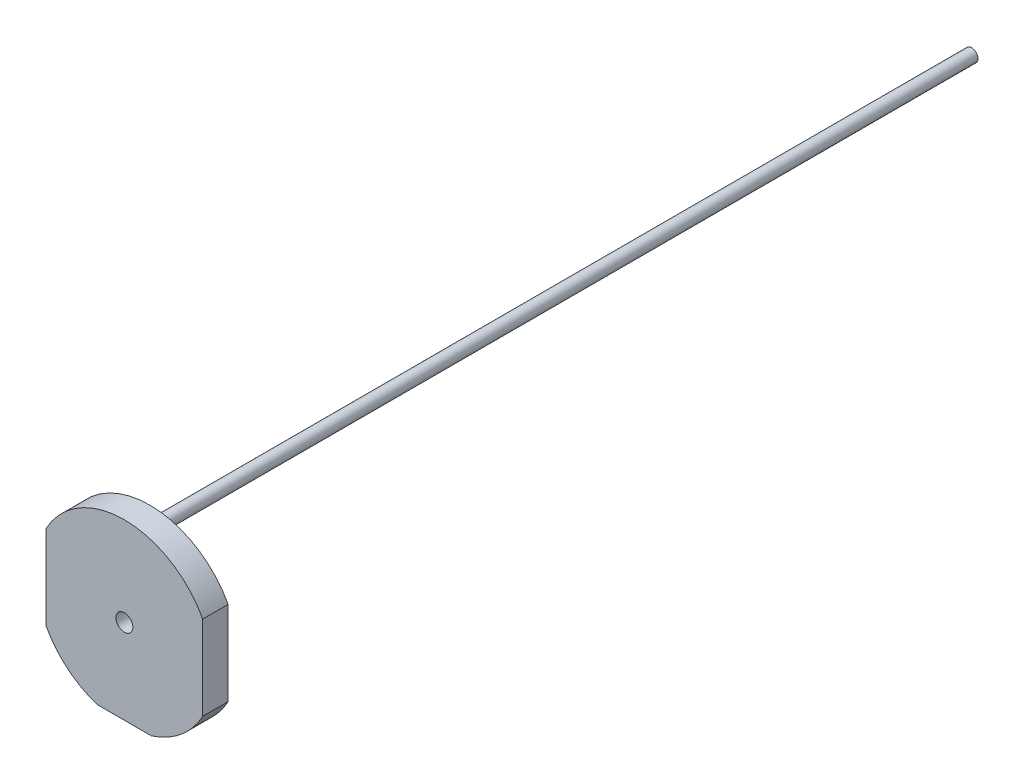
ISO-10303-21;
HEADER;
FILE_DESCRIPTION(('STEP AP214'),'2;1');
FILE_NAME('part.step','',(''),(''),'','','');
FILE_SCHEMA(('AUTOMOTIVE_DESIGN { 1 0 10303 214 1 1 1 1 }'));
ENDSEC;
DATA;
#1=APPLICATION_CONTEXT('core data for automotive mechanical design processes');
#2=APPLICATION_PROTOCOL_DEFINITION('international standard','automotive_design',2000,#1);
#3=PRODUCT_CONTEXT('',#1,'mechanical');
#4=PRODUCT('Part','Part','',(#3));
#5=PRODUCT_RELATED_PRODUCT_CATEGORY('part','',(#4));
#6=PRODUCT_DEFINITION_FORMATION('','',#4);
#7=PRODUCT_DEFINITION_CONTEXT('part definition',#1,'design');
#8=PRODUCT_DEFINITION('design','',#6,#7);
#9=PRODUCT_DEFINITION_SHAPE('','',#8);
#10=(LENGTH_UNIT() NAMED_UNIT(*) SI_UNIT(.MILLI.,.METRE.));
#11=(NAMED_UNIT(*) PLANE_ANGLE_UNIT() SI_UNIT($,.RADIAN.));
#12=(NAMED_UNIT(*) SI_UNIT($,.STERADIAN.) SOLID_ANGLE_UNIT());
#13=UNCERTAINTY_MEASURE_WITH_UNIT(LENGTH_MEASURE(1.E-05),#10,'distance_accuracy_value','');
#14=(GEOMETRIC_REPRESENTATION_CONTEXT(3) GLOBAL_UNCERTAINTY_ASSIGNED_CONTEXT((#13)) GLOBAL_UNIT_ASSIGNED_CONTEXT((#10,
#11,#12)) REPRESENTATION_CONTEXT('',''));
#15=CARTESIAN_POINT('',(0.,0.,0.));
#16=DIRECTION('',(0.,0.,1.));
#17=DIRECTION('',(1.,0.,0.));
#18=AXIS2_PLACEMENT_3D('',#15,#16,#17);
#19=CARTESIAN_POINT('',(0.,0.,-6.));
#20=DIRECTION('',(0.,0.,1.));
#21=DIRECTION('',(1.,0.,0.));
#22=AXIS2_PLACEMENT_3D('',#19,#20,#21);
#23=CYLINDRICAL_SURFACE('',#22,21.);
#24=CARTESIAN_POINT('',(0.,0.,0.));
#25=DIRECTION('',(0.,0.,1.));
#26=DIRECTION('',(1.,0.,0.));
#27=AXIS2_PLACEMENT_3D('',#24,#25,#26);
#28=CIRCLE('',#27,21.);
#29=CARTESIAN_POINT('',(-18.5,-9.9373034571759,0.));
#30=VERTEX_POINT('',#29);
#31=CARTESIAN_POINT('',(-6.40312423743285,-20.,0.));
#32=VERTEX_POINT('',#31);
#33=EDGE_CURVE('E136',#30,#32,#28,.T.);
#34=ORIENTED_EDGE('',*,*,#33,.F.);
#35=DIRECTION('',(0.,0.,1.));
#36=VECTOR('',#35,1.);
#37=CARTESIAN_POINT('',(-18.5,-9.9373034571759,-6.));
#38=LINE('',#37,#36);
#39=CARTESIAN_POINT('',(-18.5,-9.9373034571759,-6.));
#40=VERTEX_POINT('',#39);
#41=EDGE_CURVE('E11',#40,#30,#38,.T.);
#42=ORIENTED_EDGE('',*,*,#41,.F.);
#43=CARTESIAN_POINT('',(0.,0.,-6.));
#44=DIRECTION('',(0.,0.,1.));
#45=DIRECTION('',(1.,0.,0.));
#46=AXIS2_PLACEMENT_3D('',#43,#44,#45);
#47=CIRCLE('',#46,21.);
#48=CARTESIAN_POINT('',(-6.40312423743285,-20.,-6.));
#49=VERTEX_POINT('',#48);
#50=EDGE_CURVE('E157',#40,#49,#47,.T.);
#51=ORIENTED_EDGE('',*,*,#50,.T.);
#52=DIRECTION('',(0.,0.,1.));
#53=VECTOR('',#52,1.);
#54=CARTESIAN_POINT('',(-6.40312423743285,-20.,-6.));
#55=LINE('',#54,#53);
#56=EDGE_CURVE('E48',#49,#32,#55,.T.);
#57=ORIENTED_EDGE('',*,*,#56,.T.);
#58=EDGE_LOOP('',(#34,#42,#51,#57));
#59=FACE_BOUND('',#58,.T.);
#60=ADVANCED_FACE('F45',(#59),#23,.T.);
#61=CARTESIAN_POINT('',(-18.5,-9.9373034571759,-6.));
#62=DIRECTION('',(-1.,0.,0.));
#63=DIRECTION('',(0.,0.,1.));
#64=AXIS2_PLACEMENT_3D('',#61,#62,#63);
#65=PLANE('',#64);
#66=DIRECTION('',(0.,-1.,0.));
#67=VECTOR('',#66,1.);
#68=CARTESIAN_POINT('',(-18.5,-9.9373034571759,0.));
#69=LINE('',#68,#67);
#70=CARTESIAN_POINT('',(-18.5,9.9373034571759,0.));
#71=VERTEX_POINT('',#70);
#72=EDGE_CURVE('E154',#71,#30,#69,.T.);
#73=ORIENTED_EDGE('',*,*,#72,.F.);
#74=DIRECTION('',(0.,0.,1.));
#75=VECTOR('',#74,1.);
#76=CARTESIAN_POINT('',(-18.5,9.9373034571759,-6.));
#77=LINE('',#76,#75);
#78=CARTESIAN_POINT('',(-18.5,9.9373034571759,-6.));
#79=VERTEX_POINT('',#78);
#80=EDGE_CURVE('E55',#79,#71,#77,.T.);
#81=ORIENTED_EDGE('',*,*,#80,.F.);
#82=DIRECTION('',(0.,-1.,0.));
#83=VECTOR('',#82,1.);
#84=CARTESIAN_POINT('',(-18.5,-9.9373034571759,-6.));
#85=LINE('',#84,#83);
#86=EDGE_CURVE('E122',#79,#40,#85,.T.);
#87=ORIENTED_EDGE('',*,*,#86,.T.);
#88=ORIENTED_EDGE('',*,*,#41,.T.);
#89=EDGE_LOOP('',(#73,#81,#87,#88));
#90=FACE_BOUND('',#89,.T.);
#91=ADVANCED_FACE('F169',(#90),#65,.T.);
#92=CARTESIAN_POINT('',(0.,0.,-6.));
#93=DIRECTION('',(0.,0.,1.));
#94=DIRECTION('',(1.,0.,0.));
#95=AXIS2_PLACEMENT_3D('',#92,#93,#94);
#96=CYLINDRICAL_SURFACE('',#95,21.);
#97=CARTESIAN_POINT('',(0.,0.,0.));
#98=DIRECTION('',(0.,0.,1.));
#99=DIRECTION('',(1.,0.,0.));
#100=AXIS2_PLACEMENT_3D('',#97,#98,#99);
#101=CIRCLE('',#100,21.);
#102=CARTESIAN_POINT('',(18.5,9.9373034571759,0.));
#103=VERTEX_POINT('',#102);
#104=EDGE_CURVE('E108',#103,#71,#101,.T.);
#105=ORIENTED_EDGE('',*,*,#104,.F.);
#106=DIRECTION('',(0.,0.,1.));
#107=VECTOR('',#106,1.);
#108=CARTESIAN_POINT('',(18.5,9.9373034571759,-6.));
#109=LINE('',#108,#107);
#110=CARTESIAN_POINT('',(18.5,9.9373034571759,-6.));
#111=VERTEX_POINT('',#110);
#112=EDGE_CURVE('E103',#111,#103,#109,.T.);
#113=ORIENTED_EDGE('',*,*,#112,.F.);
#114=CARTESIAN_POINT('',(0.,0.,-6.));
#115=DIRECTION('',(0.,0.,1.));
#116=DIRECTION('',(1.,0.,0.));
#117=AXIS2_PLACEMENT_3D('',#114,#115,#116);
#118=CIRCLE('',#117,21.);
#119=EDGE_CURVE('E106',#111,#79,#118,.T.);
#120=ORIENTED_EDGE('',*,*,#119,.T.);
#121=ORIENTED_EDGE('',*,*,#80,.T.);
#122=EDGE_LOOP('',(#105,#113,#120,#121));
#123=FACE_BOUND('',#122,.T.);
#124=ADVANCED_FACE('F105',(#123),#96,.T.);
#125=CARTESIAN_POINT('',(18.5,-9.9373034571759,-6.));
#126=DIRECTION('',(1.,0.,0.));
#127=DIRECTION('',(0.,0.,-1.));
#128=AXIS2_PLACEMENT_3D('',#125,#126,#127);
#129=PLANE('',#128);
#130=DIRECTION('',(0.,1.,0.));
#131=VECTOR('',#130,1.);
#132=CARTESIAN_POINT('',(18.5,-9.9373034571759,0.));
#133=LINE('',#132,#131);
#134=CARTESIAN_POINT('',(18.5,-9.9373034571759,0.));
#135=VERTEX_POINT('',#134);
#136=EDGE_CURVE('E149',#135,#103,#133,.T.);
#137=ORIENTED_EDGE('',*,*,#136,.F.);
#138=DIRECTION('',(0.,0.,1.));
#139=VECTOR('',#138,1.);
#140=CARTESIAN_POINT('',(18.5,-9.9373034571759,-6.));
#141=LINE('',#140,#139);
#142=CARTESIAN_POINT('',(18.5,-9.9373034571759,-6.));
#143=VERTEX_POINT('',#142);
#144=EDGE_CURVE('E114',#143,#135,#141,.T.);
#145=ORIENTED_EDGE('',*,*,#144,.F.);
#146=DIRECTION('',(0.,1.,0.));
#147=VECTOR('',#146,1.);
#148=CARTESIAN_POINT('',(18.5,-9.9373034571759,-6.));
#149=LINE('',#148,#147);
#150=EDGE_CURVE('E120',#143,#111,#149,.T.);
#151=ORIENTED_EDGE('',*,*,#150,.T.);
#152=ORIENTED_EDGE('',*,*,#112,.T.);
#153=EDGE_LOOP('',(#137,#145,#151,#152));
#154=FACE_BOUND('',#153,.T.);
#155=ADVANCED_FACE('F125',(#154),#129,.T.);
#156=CARTESIAN_POINT('',(0.,0.,-6.));
#157=DIRECTION('',(0.,0.,1.));
#158=DIRECTION('',(1.,0.,0.));
#159=AXIS2_PLACEMENT_3D('',#156,#157,#158);
#160=CYLINDRICAL_SURFACE('',#159,21.);
#161=CARTESIAN_POINT('',(0.,0.,0.));
#162=DIRECTION('',(0.,0.,1.));
#163=DIRECTION('',(1.,0.,0.));
#164=AXIS2_PLACEMENT_3D('',#161,#162,#163);
#165=CIRCLE('',#164,21.);
#166=CARTESIAN_POINT('',(6.40312423743285,-20.,0.));
#167=VERTEX_POINT('',#166);
#168=EDGE_CURVE('E145',#167,#135,#165,.T.);
#169=ORIENTED_EDGE('',*,*,#168,.F.);
#170=DIRECTION('',(0.,0.,1.));
#171=VECTOR('',#170,1.);
#172=CARTESIAN_POINT('',(6.40312423743285,-20.,-6.));
#173=LINE('',#172,#171);
#174=CARTESIAN_POINT('',(6.40312423743285,-20.,-6.));
#175=VERTEX_POINT('',#174);
#176=EDGE_CURVE('E162',#175,#167,#173,.T.);
#177=ORIENTED_EDGE('',*,*,#176,.F.);
#178=CARTESIAN_POINT('',(0.,0.,-6.));
#179=DIRECTION('',(0.,0.,1.));
#180=DIRECTION('',(1.,0.,0.));
#181=AXIS2_PLACEMENT_3D('',#178,#179,#180);
#182=CIRCLE('',#181,21.);
#183=EDGE_CURVE('E127',#175,#143,#182,.T.);
#184=ORIENTED_EDGE('',*,*,#183,.T.);
#185=ORIENTED_EDGE('',*,*,#144,.T.);
#186=EDGE_LOOP('',(#169,#177,#184,#185));
#187=FACE_BOUND('',#186,.T.);
#188=ADVANCED_FACE('F182',(#187),#160,.T.);
#189=CARTESIAN_POINT('',(-6.40312423743285,-20.,-6.));
#190=DIRECTION('',(0.,-1.,0.));
#191=DIRECTION('',(0.,0.,-1.));
#192=AXIS2_PLACEMENT_3D('',#189,#190,#191);
#193=PLANE('',#192);
#194=DIRECTION('',(1.,0.,0.));
#195=VECTOR('',#194,1.);
#196=CARTESIAN_POINT('',(-6.40312423743285,-20.,0.));
#197=LINE('',#196,#195);
#198=EDGE_CURVE('E140',#32,#167,#197,.T.);
#199=ORIENTED_EDGE('',*,*,#198,.F.);
#200=ORIENTED_EDGE('',*,*,#56,.F.);
#201=DIRECTION('',(1.,0.,0.));
#202=VECTOR('',#201,1.);
#203=CARTESIAN_POINT('',(-6.40312423743285,-20.,-6.));
#204=LINE('',#203,#202);
#205=EDGE_CURVE('E130',#49,#175,#204,.T.);
#206=ORIENTED_EDGE('',*,*,#205,.T.);
#207=ORIENTED_EDGE('',*,*,#176,.T.);
#208=EDGE_LOOP('',(#199,#200,#206,#207));
#209=FACE_BOUND('',#208,.T.);
#210=ADVANCED_FACE('F166',(#209),#193,.T.);
#211=CARTESIAN_POINT('',(0.,0.,-6.));
#212=DIRECTION('',(0.,0.,1.));
#213=DIRECTION('',(1.,0.,0.));
#214=AXIS2_PLACEMENT_3D('',#211,#212,#213);
#215=PLANE('',#214);
#216=CARTESIAN_POINT('',(0.,16.,-6.00000000000001));
#217=DIRECTION('',(0.,0.,1.));
#218=DIRECTION('',(1.,0.,0.));
#219=AXIS2_PLACEMENT_3D('',#216,#217,#218);
#220=CIRCLE('',#219,1.5);
#221=CARTESIAN_POINT('',(1.5,16.,-6.00000000000001));
#222=VERTEX_POINT('',#221);
#223=EDGE_CURVE('E214',#222,#222,#220,.T.);
#224=ORIENTED_EDGE('',*,*,#223,.T.);
#225=EDGE_LOOP('',(#224));
#226=FACE_BOUND('',#225,.T.);
#227=CARTESIAN_POINT('',(0.,0.,-6.));
#228=DIRECTION('',(0.,0.,1.));
#229=DIRECTION('',(1.,0.,0.));
#230=AXIS2_PLACEMENT_3D('',#227,#228,#229);
#231=CIRCLE('',#230,2.);
#232=CARTESIAN_POINT('',(2.,0.,-6.));
#233=VERTEX_POINT('',#232);
#234=EDGE_CURVE('E141',#233,#233,#231,.T.);
#235=ORIENTED_EDGE('',*,*,#234,.T.);
#236=EDGE_LOOP('',(#235));
#237=FACE_BOUND('',#236,.T.);
#238=ORIENTED_EDGE('',*,*,#50,.F.);
#239=ORIENTED_EDGE('',*,*,#86,.F.);
#240=ORIENTED_EDGE('',*,*,#119,.F.);
#241=ORIENTED_EDGE('',*,*,#150,.F.);
#242=ORIENTED_EDGE('',*,*,#183,.F.);
#243=ORIENTED_EDGE('',*,*,#205,.F.);
#244=EDGE_LOOP('',(#238,#239,#240,#241,#242,#243));
#245=FACE_BOUND('',#244,.T.);
#246=ADVANCED_FACE('F118',(#226,#237,#245),#215,.F.);
#247=CARTESIAN_POINT('',(0.,0.,0.));
#248=DIRECTION('',(0.,0.,1.));
#249=DIRECTION('',(1.,0.,0.));
#250=AXIS2_PLACEMENT_3D('',#247,#248,#249);
#251=PLANE('',#250);
#252=CARTESIAN_POINT('',(0.,0.,0.));
#253=DIRECTION('',(0.,0.,1.));
#254=DIRECTION('',(1.,0.,0.));
#255=AXIS2_PLACEMENT_3D('',#252,#253,#254);
#256=CIRCLE('',#255,2.);
#257=CARTESIAN_POINT('',(2.,0.,0.));
#258=VERTEX_POINT('',#257);
#259=EDGE_CURVE('E217',#258,#258,#256,.T.);
#260=ORIENTED_EDGE('',*,*,#259,.F.);
#261=EDGE_LOOP('',(#260));
#262=FACE_BOUND('',#261,.T.);
#263=ORIENTED_EDGE('',*,*,#33,.T.);
#264=ORIENTED_EDGE('',*,*,#198,.T.);
#265=ORIENTED_EDGE('',*,*,#168,.T.);
#266=ORIENTED_EDGE('',*,*,#136,.T.);
#267=ORIENTED_EDGE('',*,*,#104,.T.);
#268=ORIENTED_EDGE('',*,*,#72,.T.);
#269=EDGE_LOOP('',(#263,#264,#265,#266,#267,#268));
#270=FACE_BOUND('',#269,.T.);
#271=ADVANCED_FACE('F168',(#262,#270),#251,.T.);
#272=CARTESIAN_POINT('',(0.,0.,-6.));
#273=DIRECTION('',(0.,0.,1.));
#274=DIRECTION('',(1.,0.,0.));
#275=AXIS2_PLACEMENT_3D('',#272,#273,#274);
#276=CYLINDRICAL_SURFACE('',#275,2.);
#277=ORIENTED_EDGE('',*,*,#234,.F.);
#278=EDGE_LOOP('',(#277));
#279=FACE_BOUND('',#278,.T.);
#280=ORIENTED_EDGE('',*,*,#259,.T.);
#281=EDGE_LOOP('',(#280));
#282=FACE_BOUND('',#281,.T.);
#283=ADVANCED_FACE('F194',(#279,#282),#276,.F.);
#284=CARTESIAN_POINT('',(0.,16.,-200.));
#285=DIRECTION('',(0.,0.,1.));
#286=DIRECTION('',(1.,0.,0.));
#287=AXIS2_PLACEMENT_3D('',#284,#285,#286);
#288=CYLINDRICAL_SURFACE('',#287,1.5);
#289=CARTESIAN_POINT('',(0.,16.,-200.));
#290=DIRECTION('',(0.,0.,1.));
#291=DIRECTION('',(1.,0.,0.));
#292=AXIS2_PLACEMENT_3D('',#289,#290,#291);
#293=CIRCLE('',#292,1.5);
#294=CARTESIAN_POINT('',(1.5,16.,-200.));
#295=VERTEX_POINT('',#294);
#296=EDGE_CURVE('E212',#295,#295,#293,.T.);
#297=ORIENTED_EDGE('',*,*,#296,.T.);
#298=EDGE_LOOP('',(#297));
#299=FACE_BOUND('',#298,.T.);
#300=ORIENTED_EDGE('',*,*,#223,.F.);
#301=EDGE_LOOP('',(#300));
#302=FACE_BOUND('',#301,.T.);
#303=ADVANCED_FACE('F200',(#299,#302),#288,.T.);
#304=CARTESIAN_POINT('',(0.,0.,-200.));
#305=DIRECTION('',(0.,0.,1.));
#306=DIRECTION('',(1.,0.,0.));
#307=AXIS2_PLACEMENT_3D('',#304,#305,#306);
#308=PLANE('',#307);
#309=ORIENTED_EDGE('',*,*,#296,.F.);
#310=EDGE_LOOP('',(#309));
#311=FACE_BOUND('',#310,.T.);
#312=ADVANCED_FACE('F204',(#311),#308,.F.);
#313=CLOSED_SHELL('',(#60,#91,#124,#155,#188,#210,#246,#271,#283,#303,#312));
#314=MANIFOLD_SOLID_BREP('B2',#313);
#315=ADVANCED_BREP_SHAPE_REPRESENTATION('',(#18,#314),#14);
#316=SHAPE_DEFINITION_REPRESENTATION(#9,#315);
ENDSEC;
END-ISO-10303-21;
